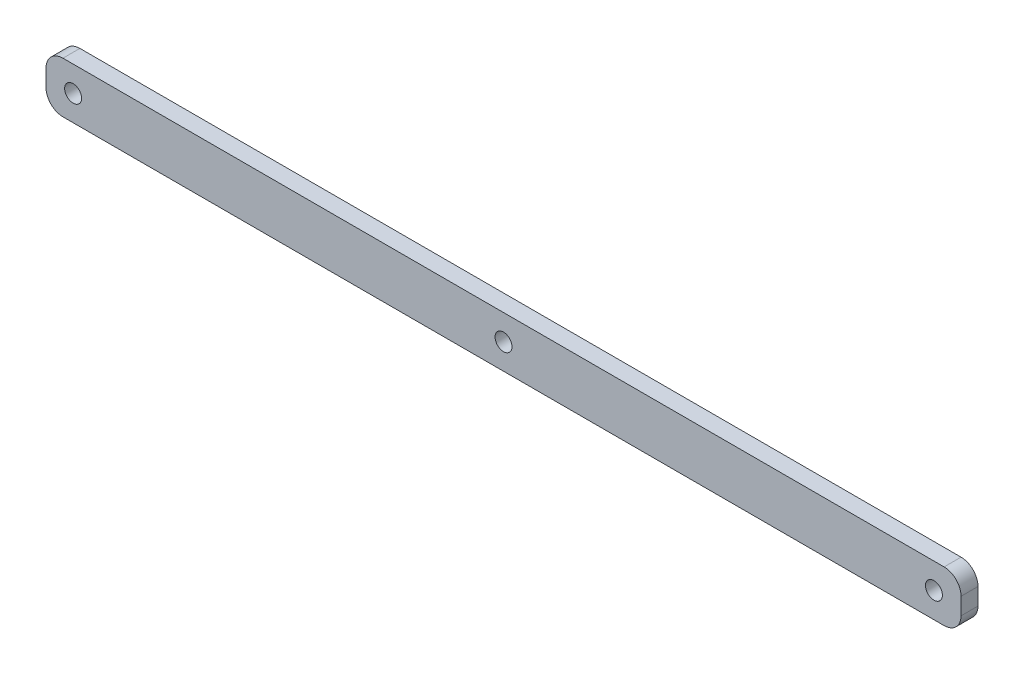
ISO-10303-21;
HEADER;
FILE_DESCRIPTION(('STEP AP214'),'2;1');
FILE_NAME('part.step','',(''),(''),'','','');
FILE_SCHEMA(('AUTOMOTIVE_DESIGN { 1 0 10303 214 1 1 1 1 }'));
ENDSEC;
DATA;
#1=APPLICATION_CONTEXT('core data for automotive mechanical design processes');
#2=APPLICATION_PROTOCOL_DEFINITION('international standard','automotive_design',2000,#1);
#3=PRODUCT_CONTEXT('',#1,'mechanical');
#4=PRODUCT('Part','Part','',(#3));
#5=PRODUCT_RELATED_PRODUCT_CATEGORY('part','',(#4));
#6=PRODUCT_DEFINITION_FORMATION('','',#4);
#7=PRODUCT_DEFINITION_CONTEXT('part definition',#1,'design');
#8=PRODUCT_DEFINITION('design','',#6,#7);
#9=PRODUCT_DEFINITION_SHAPE('','',#8);
#10=(LENGTH_UNIT() NAMED_UNIT(*) SI_UNIT(.MILLI.,.METRE.));
#11=(NAMED_UNIT(*) PLANE_ANGLE_UNIT() SI_UNIT($,.RADIAN.));
#12=(NAMED_UNIT(*) SI_UNIT($,.STERADIAN.) SOLID_ANGLE_UNIT());
#13=UNCERTAINTY_MEASURE_WITH_UNIT(LENGTH_MEASURE(1.E-05),#10,'distance_accuracy_value','');
#14=(GEOMETRIC_REPRESENTATION_CONTEXT(3) GLOBAL_UNCERTAINTY_ASSIGNED_CONTEXT((#13)) GLOBAL_UNIT_ASSIGNED_CONTEXT((#10,
#11,#12)) REPRESENTATION_CONTEXT('',''));
#15=CARTESIAN_POINT('',(0.,0.,0.));
#16=DIRECTION('',(0.,0.,1.));
#17=DIRECTION('',(1.,0.,0.));
#18=AXIS2_PLACEMENT_3D('',#15,#16,#17);
#19=CARTESIAN_POINT('',(260.,10.0000000000006,10.000000000001));
#20=DIRECTION('',(0.,0.,-1.));
#21=DIRECTION('',(-1.,0.,0.));
#22=AXIS2_PLACEMENT_3D('',#19,#20,#21);
#23=CYLINDRICAL_SURFACE('',#22,10.);
#24=CARTESIAN_POINT('',(260.,10.000000000001,1.33226762955019E-12));
#25=DIRECTION('',(0.,0.,1.));
#26=DIRECTION('',(1.,0.,0.));
#27=AXIS2_PLACEMENT_3D('',#24,#25,#26);
#28=CIRCLE('',#27,10.);
#29=CARTESIAN_POINT('',(260.,8.60422844084496E-13,1.0547118733939E-12));
#30=VERTEX_POINT('',#29);
#31=CARTESIAN_POINT('',(270.,10.0000000000007,1.4432899320127E-12));
#32=VERTEX_POINT('',#31);
#33=EDGE_CURVE('E130',#30,#32,#28,.T.);
#34=ORIENTED_EDGE('',*,*,#33,.T.);
#35=DIRECTION('',(0.,0.,-1.));
#36=VECTOR('',#35,1.);
#37=CARTESIAN_POINT('',(270.,10.0000000000009,10.0000000000013));
#38=LINE('',#37,#36);
#39=CARTESIAN_POINT('',(270.,10.0000000000009,10.0000000000013));
#40=VERTEX_POINT('',#39);
#41=EDGE_CURVE('E11',#40,#32,#38,.T.);
#42=ORIENTED_EDGE('',*,*,#41,.F.);
#43=CARTESIAN_POINT('',(260.,10.0000000000006,10.000000000001));
#44=DIRECTION('',(0.,0.,1.));
#45=DIRECTION('',(1.,0.,0.));
#46=AXIS2_PLACEMENT_3D('',#43,#44,#45);
#47=CIRCLE('',#46,10.);
#48=CARTESIAN_POINT('',(260.,6.66133814775094E-13,10.0000000000011));
#49=VERTEX_POINT('',#48);
#50=EDGE_CURVE('E145',#49,#40,#47,.T.);
#51=ORIENTED_EDGE('',*,*,#50,.F.);
#52=DIRECTION('',(0.,0.,-1.));
#53=VECTOR('',#52,1.);
#54=CARTESIAN_POINT('',(260.,6.66133814775094E-13,10.0000000000011));
#55=LINE('',#54,#53);
#56=EDGE_CURVE('E126',#49,#30,#55,.T.);
#57=ORIENTED_EDGE('',*,*,#56,.T.);
#58=EDGE_LOOP('',(#34,#42,#51,#57));
#59=FACE_BOUND('',#58,.T.);
#60=ADVANCED_FACE('F34',(#59),#23,.T.);
#61=CARTESIAN_POINT('',(270.,20.0000000000008,10.0000000000007));
#62=DIRECTION('',(-1.,0.,0.));
#63=DIRECTION('',(0.,0.,1.));
#64=AXIS2_PLACEMENT_3D('',#61,#62,#63);
#65=PLANE('',#64);
#66=DIRECTION('',(0.,1.,0.));
#67=VECTOR('',#66,1.);
#68=CARTESIAN_POINT('',(270.,20.0000000000007,9.99200722162641E-13));
#69=LINE('',#68,#67);
#70=CARTESIAN_POINT('',(270.,20.0000000000007,9.99200722162641E-13));
#71=VERTEX_POINT('',#70);
#72=EDGE_CURVE('E133',#32,#71,#69,.T.);
#73=ORIENTED_EDGE('',*,*,#72,.T.);
#74=DIRECTION('',(0.,0.,-1.));
#75=VECTOR('',#74,1.);
#76=CARTESIAN_POINT('',(270.,20.0000000000008,10.0000000000007));
#77=LINE('',#76,#75);
#78=CARTESIAN_POINT('',(270.,20.0000000000008,10.0000000000007));
#79=VERTEX_POINT('',#78);
#80=EDGE_CURVE('E42',#79,#71,#77,.T.);
#81=ORIENTED_EDGE('',*,*,#80,.F.);
#82=DIRECTION('',(0.,1.,0.));
#83=VECTOR('',#82,1.);
#84=CARTESIAN_POINT('',(270.,20.0000000000008,10.0000000000007));
#85=LINE('',#84,#83);
#86=EDGE_CURVE('E93',#40,#79,#85,.T.);
#87=ORIENTED_EDGE('',*,*,#86,.F.);
#88=ORIENTED_EDGE('',*,*,#41,.T.);
#89=EDGE_LOOP('',(#73,#81,#87,#88));
#90=FACE_BOUND('',#89,.T.);
#91=ADVANCED_FACE('F224',(#90),#65,.F.);
#92=CARTESIAN_POINT('',(260.,20.0000000000007,10.0000000000012));
#93=DIRECTION('',(0.,0.,-1.));
#94=DIRECTION('',(-1.,0.,0.));
#95=AXIS2_PLACEMENT_3D('',#92,#93,#94);
#96=CYLINDRICAL_SURFACE('',#95,10.);
#97=CARTESIAN_POINT('',(260.,20.0000000000006,9.43689570931383E-13));
#98=DIRECTION('',(0.,0.,1.));
#99=DIRECTION('',(-1.,0.,0.));
#100=AXIS2_PLACEMENT_3D('',#97,#98,#99);
#101=CIRCLE('',#100,10.);
#102=CARTESIAN_POINT('',(260.000000000001,30.0000000000008,1.27675647831893E-12));
#103=VERTEX_POINT('',#102);
#104=EDGE_CURVE('E136',#71,#103,#101,.T.);
#105=ORIENTED_EDGE('',*,*,#104,.T.);
#106=DIRECTION('',(0.,0.,-1.));
#107=VECTOR('',#106,1.);
#108=CARTESIAN_POINT('',(260.,30.0000000000011,10.000000000001));
#109=LINE('',#108,#107);
#110=CARTESIAN_POINT('',(260.,30.0000000000011,10.000000000001));
#111=VERTEX_POINT('',#110);
#112=EDGE_CURVE('E152',#111,#103,#109,.T.);
#113=ORIENTED_EDGE('',*,*,#112,.F.);
#114=CARTESIAN_POINT('',(260.,20.0000000000007,10.0000000000012));
#115=DIRECTION('',(0.,0.,1.));
#116=DIRECTION('',(-1.,0.,0.));
#117=AXIS2_PLACEMENT_3D('',#114,#115,#116);
#118=CIRCLE('',#117,10.);
#119=EDGE_CURVE('E160',#79,#111,#118,.T.);
#120=ORIENTED_EDGE('',*,*,#119,.F.);
#121=ORIENTED_EDGE('',*,*,#80,.T.);
#122=EDGE_LOOP('',(#105,#113,#120,#121));
#123=FACE_BOUND('',#122,.T.);
#124=ADVANCED_FACE('F158',(#123),#96,.T.);
#125=CARTESIAN_POINT('',(-260.,29.9999999999998,9.99999999999979));
#126=DIRECTION('',(0.,-1.,0.));
#127=DIRECTION('',(0.,0.,-1.));
#128=AXIS2_PLACEMENT_3D('',#125,#126,#127);
#129=PLANE('',#128);
#130=DIRECTION('',(-1.,0.,0.));
#131=VECTOR('',#130,1.);
#132=CARTESIAN_POINT('',(-260.,29.9999999999999,-1.11022302462516E-13));
#133=LINE('',#132,#131);
#134=CARTESIAN_POINT('',(-260.,29.9999999999999,-1.11022302462516E-13));
#135=VERTEX_POINT('',#134);
#136=EDGE_CURVE('E138',#103,#135,#133,.T.);
#137=ORIENTED_EDGE('',*,*,#136,.T.);
#138=DIRECTION('',(0.,0.,-1.));
#139=VECTOR('',#138,1.);
#140=CARTESIAN_POINT('',(-260.,29.9999999999998,9.99999999999979));
#141=LINE('',#140,#139);
#142=CARTESIAN_POINT('',(-260.,29.9999999999998,9.99999999999979));
#143=VERTEX_POINT('',#142);
#144=EDGE_CURVE('E149',#143,#135,#141,.T.);
#145=ORIENTED_EDGE('',*,*,#144,.F.);
#146=DIRECTION('',(-1.,0.,0.));
#147=VECTOR('',#146,1.);
#148=CARTESIAN_POINT('',(-260.,29.9999999999998,9.99999999999979));
#149=LINE('',#148,#147);
#150=EDGE_CURVE('E172',#111,#143,#149,.T.);
#151=ORIENTED_EDGE('',*,*,#150,.F.);
#152=ORIENTED_EDGE('',*,*,#112,.T.);
#153=EDGE_LOOP('',(#137,#145,#151,#152));
#154=FACE_BOUND('',#153,.T.);
#155=ADVANCED_FACE('F168',(#154),#129,.F.);
#156=CARTESIAN_POINT('',(-259.999999999999,19.9999999999995,9.99999999999973));
#157=DIRECTION('',(0.,0.,-1.));
#158=DIRECTION('',(-1.,0.,0.));
#159=AXIS2_PLACEMENT_3D('',#156,#157,#158);
#160=CYLINDRICAL_SURFACE('',#159,10.);
#161=CARTESIAN_POINT('',(-260.,19.9999999999999,-1.66533453693773E-13));
#162=DIRECTION('',(0.,0.,1.));
#163=DIRECTION('',(-1.,0.,0.));
#164=AXIS2_PLACEMENT_3D('',#161,#162,#163);
#165=CIRCLE('',#164,10.);
#166=CARTESIAN_POINT('',(-270.,19.9999999999999,-2.77555756156289E-13));
#167=VERTEX_POINT('',#166);
#168=EDGE_CURVE('E140',#135,#167,#165,.T.);
#169=ORIENTED_EDGE('',*,*,#168,.T.);
#170=DIRECTION('',(0.,0.,-1.));
#171=VECTOR('',#170,1.);
#172=CARTESIAN_POINT('',(-270.,19.9999999999999,10.));
#173=LINE('',#172,#171);
#174=CARTESIAN_POINT('',(-270.,19.9999999999999,10.));
#175=VERTEX_POINT('',#174);
#176=EDGE_CURVE('E121',#175,#167,#173,.T.);
#177=ORIENTED_EDGE('',*,*,#176,.F.);
#178=CARTESIAN_POINT('',(-259.999999999999,19.9999999999995,9.99999999999973));
#179=DIRECTION('',(0.,0.,1.));
#180=DIRECTION('',(-1.,0.,0.));
#181=AXIS2_PLACEMENT_3D('',#178,#179,#180);
#182=CIRCLE('',#181,10.);
#183=EDGE_CURVE('E112',#143,#175,#182,.T.);
#184=ORIENTED_EDGE('',*,*,#183,.F.);
#185=ORIENTED_EDGE('',*,*,#144,.T.);
#186=EDGE_LOOP('',(#169,#177,#184,#185));
#187=FACE_BOUND('',#186,.T.);
#188=ADVANCED_FACE('F171',(#187),#160,.T.);
#189=CARTESIAN_POINT('',(-270.,9.99999999999987,9.99999999999979));
#190=DIRECTION('',(1.,0.,0.));
#191=DIRECTION('',(0.,0.,-1.));
#192=AXIS2_PLACEMENT_3D('',#189,#190,#191);
#193=PLANE('',#192);
#194=DIRECTION('',(0.,-1.,0.));
#195=VECTOR('',#194,1.);
#196=CARTESIAN_POINT('',(-270.,10.,-1.11022302462516E-13));
#197=LINE('',#196,#195);
#198=CARTESIAN_POINT('',(-270.,10.,-1.11022302462516E-13));
#199=VERTEX_POINT('',#198);
#200=EDGE_CURVE('E120',#167,#199,#197,.T.);
#201=ORIENTED_EDGE('',*,*,#200,.T.);
#202=DIRECTION('',(0.,0.,-1.));
#203=VECTOR('',#202,1.);
#204=CARTESIAN_POINT('',(-270.,9.99999999999987,9.99999999999979));
#205=LINE('',#204,#203);
#206=CARTESIAN_POINT('',(-270.,9.99999999999987,9.99999999999979));
#207=VERTEX_POINT('',#206);
#208=EDGE_CURVE('E117',#207,#199,#205,.T.);
#209=ORIENTED_EDGE('',*,*,#208,.F.);
#210=DIRECTION('',(0.,-1.,0.));
#211=VECTOR('',#210,1.);
#212=CARTESIAN_POINT('',(-270.,9.99999999999987,9.99999999999979));
#213=LINE('',#212,#211);
#214=EDGE_CURVE('E106',#175,#207,#213,.T.);
#215=ORIENTED_EDGE('',*,*,#214,.F.);
#216=ORIENTED_EDGE('',*,*,#176,.T.);
#217=EDGE_LOOP('',(#201,#209,#215,#216));
#218=FACE_BOUND('',#217,.T.);
#219=ADVANCED_FACE('F118',(#218),#193,.F.);
#220=CARTESIAN_POINT('',(-260.,9.99999999999956,9.99999999999973));
#221=DIRECTION('',(0.,0.,-1.));
#222=DIRECTION('',(-1.,0.,0.));
#223=AXIS2_PLACEMENT_3D('',#220,#221,#222);
#224=CYLINDRICAL_SURFACE('',#223,10.);
#225=CARTESIAN_POINT('',(-260.,10.,0.));
#226=DIRECTION('',(0.,0.,1.));
#227=DIRECTION('',(-1.,0.,0.));
#228=AXIS2_PLACEMENT_3D('',#225,#226,#227);
#229=CIRCLE('',#228,10.);
#230=CARTESIAN_POINT('',(-260.,-3.05311331771918E-13,-7.7715611723761E-13));
#231=VERTEX_POINT('',#230);
#232=EDGE_CURVE('E79',#199,#231,#229,.T.);
#233=ORIENTED_EDGE('',*,*,#232,.T.);
#234=DIRECTION('',(0.,0.,-1.));
#235=VECTOR('',#234,1.);
#236=CARTESIAN_POINT('',(-260.,0.,10.));
#237=LINE('',#236,#235);
#238=CARTESIAN_POINT('',(-260.,0.,10.));
#239=VERTEX_POINT('',#238);
#240=EDGE_CURVE('E122',#239,#231,#237,.T.);
#241=ORIENTED_EDGE('',*,*,#240,.F.);
#242=CARTESIAN_POINT('',(-260.,9.99999999999956,9.99999999999973));
#243=DIRECTION('',(0.,0.,1.));
#244=DIRECTION('',(-1.,0.,0.));
#245=AXIS2_PLACEMENT_3D('',#242,#243,#244);
#246=CIRCLE('',#245,10.);
#247=EDGE_CURVE('E110',#207,#239,#246,.T.);
#248=ORIENTED_EDGE('',*,*,#247,.F.);
#249=ORIENTED_EDGE('',*,*,#208,.T.);
#250=EDGE_LOOP('',(#233,#241,#248,#249));
#251=FACE_BOUND('',#250,.T.);
#252=ADVANCED_FACE('F124',(#251),#224,.T.);
#253=CARTESIAN_POINT('',(-260.,0.,10.));
#254=DIRECTION('',(0.,1.,0.));
#255=DIRECTION('',(-1.,0.,0.));
#256=AXIS2_PLACEMENT_3D('',#253,#254,#255);
#257=PLANE('',#256);
#258=DIRECTION('',(1.,0.,0.));
#259=VECTOR('',#258,1.);
#260=CARTESIAN_POINT('',(-260.,-3.05311331771918E-13,-7.7715611723761E-13));
#261=LINE('',#260,#259);
#262=EDGE_CURVE('E85',#231,#30,#261,.T.);
#263=ORIENTED_EDGE('',*,*,#262,.T.);
#264=ORIENTED_EDGE('',*,*,#56,.F.);
#265=DIRECTION('',(1.,0.,0.));
#266=VECTOR('',#265,1.);
#267=CARTESIAN_POINT('',(-260.,0.,10.));
#268=LINE('',#267,#266);
#269=EDGE_CURVE('E50',#239,#49,#268,.T.);
#270=ORIENTED_EDGE('',*,*,#269,.F.);
#271=ORIENTED_EDGE('',*,*,#240,.T.);
#272=EDGE_LOOP('',(#263,#264,#270,#271));
#273=FACE_BOUND('',#272,.T.);
#274=ADVANCED_FACE('F231',(#273),#257,.F.);
#275=CARTESIAN_POINT('',(260.,10.0000000000006,10.000000000001));
#276=DIRECTION('',(0.,0.,1.));
#277=DIRECTION('',(1.,0.,0.));
#278=AXIS2_PLACEMENT_3D('',#275,#276,#277);
#279=PLANE('',#278);
#280=CARTESIAN_POINT('',(0.,15.,9.99999999999995));
#281=DIRECTION('',(0.,0.,-1.));
#282=DIRECTION('',(-1.,0.,0.));
#283=AXIS2_PLACEMENT_3D('',#280,#281,#282);
#284=CIRCLE('',#283,5.);
#285=CARTESIAN_POINT('',(-4.99999999999996,15.,9.99999999999994));
#286=VERTEX_POINT('',#285);
#287=EDGE_CURVE('E182',#286,#286,#284,.T.);
#288=ORIENTED_EDGE('',*,*,#287,.T.);
#289=EDGE_LOOP('',(#288));
#290=FACE_BOUND('',#289,.T.);
#291=CARTESIAN_POINT('',(-254.,15.,9.9999999999999));
#292=DIRECTION('',(0.,0.,-1.));
#293=DIRECTION('',(-1.,0.,0.));
#294=AXIS2_PLACEMENT_3D('',#291,#292,#293);
#295=CIRCLE('',#294,4.99999999999999);
#296=CARTESIAN_POINT('',(-259.,15.,9.99999999999989));
#297=VERTEX_POINT('',#296);
#298=EDGE_CURVE('E134',#297,#297,#295,.T.);
#299=ORIENTED_EDGE('',*,*,#298,.T.);
#300=EDGE_LOOP('',(#299));
#301=FACE_BOUND('',#300,.T.);
#302=CARTESIAN_POINT('',(254.,15.0000000000007,10.0000000000008));
#303=DIRECTION('',(0.,0.,-1.));
#304=DIRECTION('',(-1.,0.,0.));
#305=AXIS2_PLACEMENT_3D('',#302,#303,#304);
#306=CIRCLE('',#305,4.99999999999999);
#307=CARTESIAN_POINT('',(249.,15.0000000000007,10.0000000000008));
#308=VERTEX_POINT('',#307);
#309=EDGE_CURVE('E181',#308,#308,#306,.T.);
#310=ORIENTED_EDGE('',*,*,#309,.T.);
#311=EDGE_LOOP('',(#310));
#312=FACE_BOUND('',#311,.T.);
#313=ORIENTED_EDGE('',*,*,#50,.T.);
#314=ORIENTED_EDGE('',*,*,#86,.T.);
#315=ORIENTED_EDGE('',*,*,#119,.T.);
#316=ORIENTED_EDGE('',*,*,#150,.T.);
#317=ORIENTED_EDGE('',*,*,#183,.T.);
#318=ORIENTED_EDGE('',*,*,#214,.T.);
#319=ORIENTED_EDGE('',*,*,#247,.T.);
#320=ORIENTED_EDGE('',*,*,#269,.T.);
#321=EDGE_LOOP('',(#313,#314,#315,#316,#317,#318,#319,#320));
#322=FACE_BOUND('',#321,.T.);
#323=ADVANCED_FACE('F108',(#290,#301,#312,#322),#279,.T.);
#324=CARTESIAN_POINT('',(260.,10.000000000001,1.33226762955019E-12));
#325=DIRECTION('',(0.,0.,1.));
#326=DIRECTION('',(1.,0.,0.));
#327=AXIS2_PLACEMENT_3D('',#324,#325,#326);
#328=PLANE('',#327);
#329=CARTESIAN_POINT('',(0.,15.0000000000002,4.44089209850063E-13));
#330=DIRECTION('',(0.,0.,-1.));
#331=DIRECTION('',(-1.,0.,0.));
#332=AXIS2_PLACEMENT_3D('',#329,#330,#331);
#333=CIRCLE('',#332,5.);
#334=CARTESIAN_POINT('',(-4.99999999999995,15.0000000000002,4.32986979603811E-13));
#335=VERTEX_POINT('',#334);
#336=EDGE_CURVE('E190',#335,#335,#333,.T.);
#337=ORIENTED_EDGE('',*,*,#336,.F.);
#338=EDGE_LOOP('',(#337));
#339=FACE_BOUND('',#338,.T.);
#340=CARTESIAN_POINT('',(-254.,15.,0.));
#341=DIRECTION('',(0.,0.,-1.));
#342=DIRECTION('',(-1.,0.,0.));
#343=AXIS2_PLACEMENT_3D('',#340,#341,#342);
#344=CIRCLE('',#343,4.99999999999999);
#345=CARTESIAN_POINT('',(-259.,15.,0.));
#346=VERTEX_POINT('',#345);
#347=EDGE_CURVE('E185',#346,#346,#344,.T.);
#348=ORIENTED_EDGE('',*,*,#347,.F.);
#349=EDGE_LOOP('',(#348));
#350=FACE_BOUND('',#349,.T.);
#351=CARTESIAN_POINT('',(254.,15.0000000000005,6.66133814775094E-13));
#352=DIRECTION('',(0.,0.,-1.));
#353=DIRECTION('',(-1.,0.,0.));
#354=AXIS2_PLACEMENT_3D('',#351,#352,#353);
#355=CIRCLE('',#354,4.99999999999999);
#356=CARTESIAN_POINT('',(249.,15.0000000000005,6.55031584528842E-13));
#357=VERTEX_POINT('',#356);
#358=EDGE_CURVE('E178',#357,#357,#355,.T.);
#359=ORIENTED_EDGE('',*,*,#358,.F.);
#360=EDGE_LOOP('',(#359));
#361=FACE_BOUND('',#360,.T.);
#362=ORIENTED_EDGE('',*,*,#33,.F.);
#363=ORIENTED_EDGE('',*,*,#262,.F.);
#364=ORIENTED_EDGE('',*,*,#232,.F.);
#365=ORIENTED_EDGE('',*,*,#200,.F.);
#366=ORIENTED_EDGE('',*,*,#168,.F.);
#367=ORIENTED_EDGE('',*,*,#136,.F.);
#368=ORIENTED_EDGE('',*,*,#104,.F.);
#369=ORIENTED_EDGE('',*,*,#72,.F.);
#370=EDGE_LOOP('',(#362,#363,#364,#365,#366,#367,#368,#369));
#371=FACE_BOUND('',#370,.T.);
#372=ADVANCED_FACE('F164',(#339,#350,#361,#371),#328,.F.);
#373=CARTESIAN_POINT('',(254.,15.0000000000007,10.0000000000008));
#374=DIRECTION('',(0.,0.,-1.));
#375=DIRECTION('',(-1.,0.,0.));
#376=AXIS2_PLACEMENT_3D('',#373,#374,#375);
#377=CYLINDRICAL_SURFACE('',#376,4.99999999999999);
#378=ORIENTED_EDGE('',*,*,#309,.F.);
#379=EDGE_LOOP('',(#378));
#380=FACE_BOUND('',#379,.T.);
#381=ORIENTED_EDGE('',*,*,#358,.T.);
#382=EDGE_LOOP('',(#381));
#383=FACE_BOUND('',#382,.T.);
#384=ADVANCED_FACE('F207',(#380,#383),#377,.F.);
#385=CARTESIAN_POINT('',(-254.,15.,9.9999999999999));
#386=DIRECTION('',(0.,0.,-1.));
#387=DIRECTION('',(-1.,0.,0.));
#388=AXIS2_PLACEMENT_3D('',#385,#386,#387);
#389=CYLINDRICAL_SURFACE('',#388,4.99999999999999);
#390=ORIENTED_EDGE('',*,*,#298,.F.);
#391=EDGE_LOOP('',(#390));
#392=FACE_BOUND('',#391,.T.);
#393=ORIENTED_EDGE('',*,*,#347,.T.);
#394=EDGE_LOOP('',(#393));
#395=FACE_BOUND('',#394,.T.);
#396=ADVANCED_FACE('F201',(#392,#395),#389,.F.);
#397=CARTESIAN_POINT('',(0.,15.,9.99999999999995));
#398=DIRECTION('',(0.,0.,-1.));
#399=DIRECTION('',(-1.,0.,0.));
#400=AXIS2_PLACEMENT_3D('',#397,#398,#399);
#401=CYLINDRICAL_SURFACE('',#400,5.);
#402=ORIENTED_EDGE('',*,*,#287,.F.);
#403=EDGE_LOOP('',(#402));
#404=FACE_BOUND('',#403,.T.);
#405=ORIENTED_EDGE('',*,*,#336,.T.);
#406=EDGE_LOOP('',(#405));
#407=FACE_BOUND('',#406,.T.);
#408=ADVANCED_FACE('F198',(#404,#407),#401,.F.);
#409=CLOSED_SHELL('',(#60,#91,#124,#155,#188,#219,#252,#274,#323,#372,#384,#396,#408));
#410=MANIFOLD_SOLID_BREP('B2',#409);
#411=ADVANCED_BREP_SHAPE_REPRESENTATION('',(#18,#410),#14);
#412=SHAPE_DEFINITION_REPRESENTATION(#9,#411);
ENDSEC;
END-ISO-10303-21;
